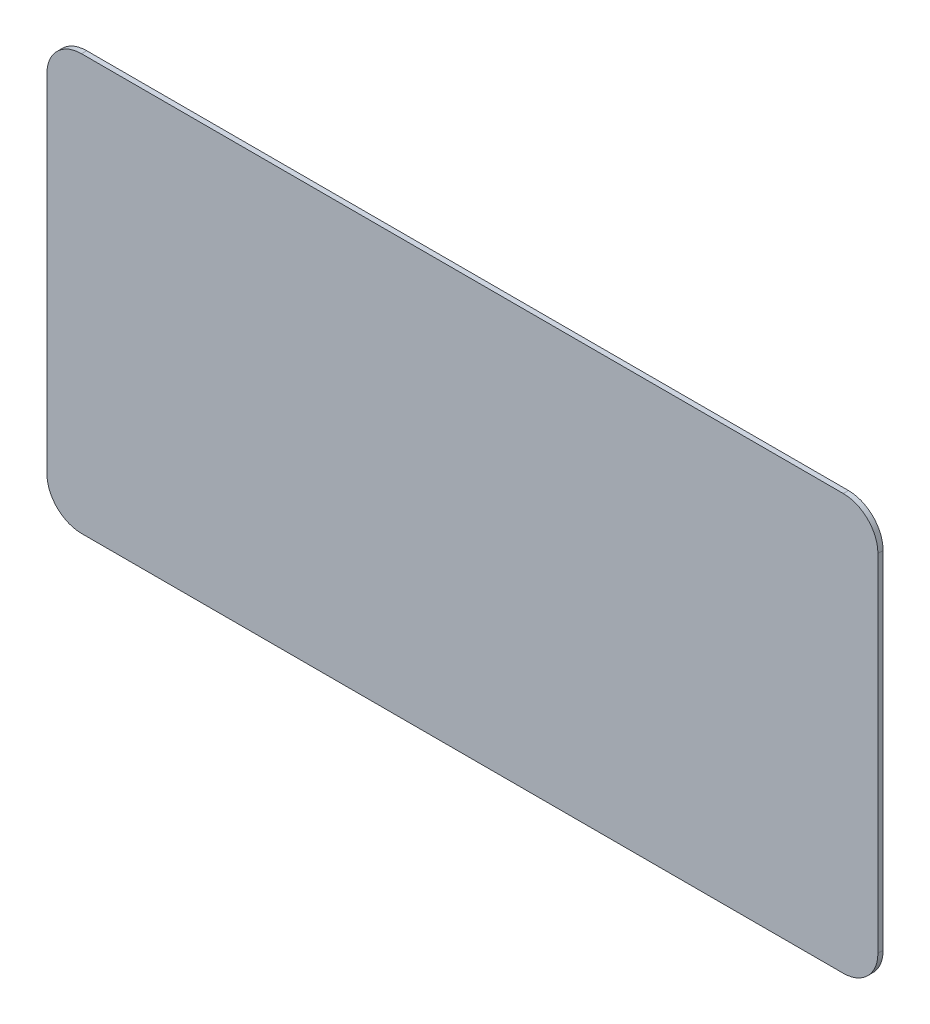
ISO-10303-21;
HEADER;
FILE_DESCRIPTION(('STEP AP214'),'2;1');
FILE_NAME('part.step','',(''),(''),'','','');
FILE_SCHEMA(('AUTOMOTIVE_DESIGN { 1 0 10303 214 1 1 1 1 }'));
ENDSEC;
DATA;
#1=APPLICATION_CONTEXT('core data for automotive mechanical design processes');
#2=APPLICATION_PROTOCOL_DEFINITION('international standard','automotive_design',2000,#1);
#3=PRODUCT_CONTEXT('',#1,'mechanical');
#4=PRODUCT('Part','Part','',(#3));
#5=PRODUCT_RELATED_PRODUCT_CATEGORY('part','',(#4));
#6=PRODUCT_DEFINITION_FORMATION('','',#4);
#7=PRODUCT_DEFINITION_CONTEXT('part definition',#1,'design');
#8=PRODUCT_DEFINITION('design','',#6,#7);
#9=PRODUCT_DEFINITION_SHAPE('','',#8);
#10=(LENGTH_UNIT() NAMED_UNIT(*) SI_UNIT(.MILLI.,.METRE.));
#11=(NAMED_UNIT(*) PLANE_ANGLE_UNIT() SI_UNIT($,.RADIAN.));
#12=(NAMED_UNIT(*) SI_UNIT($,.STERADIAN.) SOLID_ANGLE_UNIT());
#13=UNCERTAINTY_MEASURE_WITH_UNIT(LENGTH_MEASURE(1.E-05),#10,'distance_accuracy_value','');
#14=(GEOMETRIC_REPRESENTATION_CONTEXT(3) GLOBAL_UNCERTAINTY_ASSIGNED_CONTEXT((#13)) GLOBAL_UNIT_ASSIGNED_CONTEXT((#10,
#11,#12)) REPRESENTATION_CONTEXT('',''));
#15=CARTESIAN_POINT('',(0.,0.,0.));
#16=DIRECTION('',(0.,0.,1.));
#17=DIRECTION('',(1.,0.,0.));
#18=AXIS2_PLACEMENT_3D('',#15,#16,#17);
#19=CARTESIAN_POINT('',(23.,11.,0.));
#20=DIRECTION('',(0.,0.,-1.));
#21=DIRECTION('',(-1.,0.,0.));
#22=AXIS2_PLACEMENT_3D('',#19,#20,#21);
#23=PLANE('',#22);
#24=CARTESIAN_POINT('',(0.999999999999994,11.,0.));
#25=DIRECTION('',(0.,0.,-1.));
#26=DIRECTION('',(-1.,0.,0.));
#27=AXIS2_PLACEMENT_3D('',#24,#25,#26);
#28=CIRCLE('',#27,1.);
#29=CARTESIAN_POINT('',(0.999999999999997,12.,0.));
#30=VERTEX_POINT('',#29);
#31=CARTESIAN_POINT('',(0.,11.,0.));
#32=VERTEX_POINT('',#31);
#33=EDGE_CURVE('E105',#30,#32,#28,.F.);
#34=ORIENTED_EDGE('',*,*,#33,.F.);
#35=DIRECTION('',(1.,0.,0.));
#36=VECTOR('',#35,1.);
#37=CARTESIAN_POINT('',(1.,12.,0.));
#38=LINE('',#37,#36);
#39=CARTESIAN_POINT('',(23.,12.,0.));
#40=VERTEX_POINT('',#39);
#41=EDGE_CURVE('E84',#30,#40,#38,.T.);
#42=ORIENTED_EDGE('',*,*,#41,.T.);
#43=CARTESIAN_POINT('',(23.,11.,0.));
#44=DIRECTION('',(0.,0.,-1.));
#45=DIRECTION('',(-1.,0.,0.));
#46=AXIS2_PLACEMENT_3D('',#43,#44,#45);
#47=CIRCLE('',#46,1.);
#48=CARTESIAN_POINT('',(24.,11.,0.));
#49=VERTEX_POINT('',#48);
#50=EDGE_CURVE('E20',#40,#49,#47,.T.);
#51=ORIENTED_EDGE('',*,*,#50,.T.);
#52=DIRECTION('',(0.,-1.,0.));
#53=VECTOR('',#52,1.);
#54=CARTESIAN_POINT('',(24.,1.00000000000001,0.));
#55=LINE('',#54,#53);
#56=CARTESIAN_POINT('',(24.,1.,0.));
#57=VERTEX_POINT('',#56);
#58=EDGE_CURVE('E81',#49,#57,#55,.T.);
#59=ORIENTED_EDGE('',*,*,#58,.T.);
#60=CARTESIAN_POINT('',(23.,1.,0.));
#61=DIRECTION('',(0.,0.,-1.));
#62=DIRECTION('',(-1.,0.,0.));
#63=AXIS2_PLACEMENT_3D('',#60,#61,#62);
#64=CIRCLE('',#63,1.);
#65=CARTESIAN_POINT('',(23.,0.,0.));
#66=VERTEX_POINT('',#65);
#67=EDGE_CURVE('E91',#66,#57,#64,.F.);
#68=ORIENTED_EDGE('',*,*,#67,.F.);
#69=DIRECTION('',(-1.,0.,0.));
#70=VECTOR('',#69,1.);
#71=CARTESIAN_POINT('',(1.00000000000001,0.,0.));
#72=LINE('',#71,#70);
#73=CARTESIAN_POINT('',(1.,0.,0.));
#74=VERTEX_POINT('',#73);
#75=EDGE_CURVE('E116',#66,#74,#72,.T.);
#76=ORIENTED_EDGE('',*,*,#75,.T.);
#77=CARTESIAN_POINT('',(1.,1.,0.));
#78=DIRECTION('',(0.,0.,-1.));
#79=DIRECTION('',(-1.,0.,0.));
#80=AXIS2_PLACEMENT_3D('',#77,#78,#79);
#81=CIRCLE('',#80,1.);
#82=CARTESIAN_POINT('',(0.,1.,0.));
#83=VERTEX_POINT('',#82);
#84=EDGE_CURVE('E112',#83,#74,#81,.F.);
#85=ORIENTED_EDGE('',*,*,#84,.F.);
#86=DIRECTION('',(0.,1.,0.));
#87=VECTOR('',#86,1.);
#88=CARTESIAN_POINT('',(0.,1.00000000000001,0.));
#89=LINE('',#88,#87);
#90=EDGE_CURVE('E109',#83,#32,#89,.T.);
#91=ORIENTED_EDGE('',*,*,#90,.T.);
#92=EDGE_LOOP('',(#34,#42,#51,#59,#68,#76,#85,#91));
#93=FACE_BOUND('',#92,.T.);
#94=ADVANCED_FACE('F17',(#93),#23,.T.);
#95=CARTESIAN_POINT('',(24.,1.00000000000001,0.150000000000004));
#96=DIRECTION('',(-1.,0.,0.));
#97=DIRECTION('',(0.,-1.,0.));
#98=AXIS2_PLACEMENT_3D('',#95,#96,#97);
#99=PLANE('',#98);
#100=DIRECTION('',(0.,0.,-1.));
#101=VECTOR('',#100,1.);
#102=CARTESIAN_POINT('',(24.,11.,0.150000000000001));
#103=LINE('',#102,#101);
#104=CARTESIAN_POINT('',(24.,11.,0.150000000000001));
#105=VERTEX_POINT('',#104);
#106=EDGE_CURVE('E89',#105,#49,#103,.T.);
#107=ORIENTED_EDGE('',*,*,#106,.F.);
#108=DIRECTION('',(0.,1.,0.));
#109=VECTOR('',#108,1.);
#110=CARTESIAN_POINT('',(24.,11.,0.150000000000001));
#111=LINE('',#110,#109);
#112=CARTESIAN_POINT('',(24.,1.,0.150000000000004));
#113=VERTEX_POINT('',#112);
#114=EDGE_CURVE('E94',#105,#113,#111,.F.);
#115=ORIENTED_EDGE('',*,*,#114,.T.);
#116=DIRECTION('',(0.,0.,-1.));
#117=VECTOR('',#116,1.);
#118=CARTESIAN_POINT('',(24.,1.00000000000001,0.150000000000001));
#119=LINE('',#118,#117);
#120=EDGE_CURVE('E90',#57,#113,#119,.F.);
#121=ORIENTED_EDGE('',*,*,#120,.F.);
#122=ORIENTED_EDGE('',*,*,#58,.F.);
#123=EDGE_LOOP('',(#107,#115,#121,#122));
#124=FACE_BOUND('',#123,.T.);
#125=ADVANCED_FACE('F87',(#124),#99,.F.);
#126=CARTESIAN_POINT('',(23.,1.,0.150000000000001));
#127=DIRECTION('',(0.,0.,-1.));
#128=DIRECTION('',(-1.,0.,0.));
#129=AXIS2_PLACEMENT_3D('',#126,#127,#128);
#130=CYLINDRICAL_SURFACE('',#129,1.);
#131=CARTESIAN_POINT('',(23.,1.,0.150000000000004));
#132=DIRECTION('',(0.,0.,-1.));
#133=DIRECTION('',(-1.,0.,0.));
#134=AXIS2_PLACEMENT_3D('',#131,#132,#133);
#135=CIRCLE('',#134,1.);
#136=CARTESIAN_POINT('',(23.,0.,0.150000000000003));
#137=VERTEX_POINT('',#136);
#138=EDGE_CURVE('E96',#113,#137,#135,.T.);
#139=ORIENTED_EDGE('',*,*,#138,.T.);
#140=DIRECTION('',(0.,0.,1.));
#141=VECTOR('',#140,1.);
#142=CARTESIAN_POINT('',(23.,0.,0.150000000000004));
#143=LINE('',#142,#141);
#144=EDGE_CURVE('E113',#137,#66,#143,.F.);
#145=ORIENTED_EDGE('',*,*,#144,.T.);
#146=ORIENTED_EDGE('',*,*,#67,.T.);
#147=ORIENTED_EDGE('',*,*,#120,.T.);
#148=EDGE_LOOP('',(#139,#145,#146,#147));
#149=FACE_BOUND('',#148,.T.);
#150=ADVANCED_FACE('F135',(#149),#130,.T.);
#151=CARTESIAN_POINT('',(1.00000000000001,0.,0.150000000000004));
#152=DIRECTION('',(0.,1.,0.));
#153=DIRECTION('',(-1.,0.,0.));
#154=AXIS2_PLACEMENT_3D('',#151,#152,#153);
#155=PLANE('',#154);
#156=ORIENTED_EDGE('',*,*,#144,.F.);
#157=DIRECTION('',(-1.,0.,0.));
#158=VECTOR('',#157,1.);
#159=CARTESIAN_POINT('',(23.,0.,0.150000000000001));
#160=LINE('',#159,#158);
#161=CARTESIAN_POINT('',(1.,0.,0.150000000000003));
#162=VERTEX_POINT('',#161);
#163=EDGE_CURVE('E130',#137,#162,#160,.T.);
#164=ORIENTED_EDGE('',*,*,#163,.T.);
#165=DIRECTION('',(0.,0.,-1.));
#166=VECTOR('',#165,1.);
#167=CARTESIAN_POINT('',(1.00000000000001,0.,0.150000000000004));
#168=LINE('',#167,#166);
#169=EDGE_CURVE('E110',#74,#162,#168,.F.);
#170=ORIENTED_EDGE('',*,*,#169,.F.);
#171=ORIENTED_EDGE('',*,*,#75,.F.);
#172=EDGE_LOOP('',(#156,#164,#170,#171));
#173=FACE_BOUND('',#172,.T.);
#174=ADVANCED_FACE('F140',(#173),#155,.F.);
#175=CARTESIAN_POINT('',(1.,1.,0.150000000000004));
#176=DIRECTION('',(0.,0.,-1.));
#177=DIRECTION('',(-1.,0.,0.));
#178=AXIS2_PLACEMENT_3D('',#175,#176,#177);
#179=CYLINDRICAL_SURFACE('',#178,1.);
#180=CARTESIAN_POINT('',(1.,1.,0.150000000000004));
#181=DIRECTION('',(0.,0.,-1.));
#182=DIRECTION('',(-1.,0.,0.));
#183=AXIS2_PLACEMENT_3D('',#180,#181,#182);
#184=CIRCLE('',#183,1.);
#185=CARTESIAN_POINT('',(0.,1.,0.150000000000003));
#186=VERTEX_POINT('',#185);
#187=EDGE_CURVE('E127',#162,#186,#184,.T.);
#188=ORIENTED_EDGE('',*,*,#187,.T.);
#189=DIRECTION('',(0.,0.,1.));
#190=VECTOR('',#189,1.);
#191=CARTESIAN_POINT('',(0.,1.00000000000001,0.150000000000004));
#192=LINE('',#191,#190);
#193=EDGE_CURVE('E106',#186,#83,#192,.F.);
#194=ORIENTED_EDGE('',*,*,#193,.T.);
#195=ORIENTED_EDGE('',*,*,#84,.T.);
#196=ORIENTED_EDGE('',*,*,#169,.T.);
#197=EDGE_LOOP('',(#188,#194,#195,#196));
#198=FACE_BOUND('',#197,.T.);
#199=ADVANCED_FACE('F145',(#198),#179,.T.);
#200=CARTESIAN_POINT('',(0.,1.00000000000001,0.150000000000004));
#201=DIRECTION('',(1.,0.,0.));
#202=DIRECTION('',(0.,1.,0.));
#203=AXIS2_PLACEMENT_3D('',#200,#201,#202);
#204=PLANE('',#203);
#205=ORIENTED_EDGE('',*,*,#193,.F.);
#206=DIRECTION('',(0.,1.,0.));
#207=VECTOR('',#206,1.);
#208=CARTESIAN_POINT('',(0.,11.,0.150000000000001));
#209=LINE('',#208,#207);
#210=CARTESIAN_POINT('',(0.,11.,0.150000000000001));
#211=VERTEX_POINT('',#210);
#212=EDGE_CURVE('E126',#186,#211,#209,.T.);
#213=ORIENTED_EDGE('',*,*,#212,.T.);
#214=DIRECTION('',(0.,0.,-1.));
#215=VECTOR('',#214,1.);
#216=CARTESIAN_POINT('',(0.,11.,0.150000000000001));
#217=LINE('',#216,#215);
#218=EDGE_CURVE('E103',#32,#211,#217,.F.);
#219=ORIENTED_EDGE('',*,*,#218,.F.);
#220=ORIENTED_EDGE('',*,*,#90,.F.);
#221=EDGE_LOOP('',(#205,#213,#219,#220));
#222=FACE_BOUND('',#221,.T.);
#223=ADVANCED_FACE('F163',(#222),#204,.F.);
#224=CARTESIAN_POINT('',(0.999999999999994,11.,0.150000000000001));
#225=DIRECTION('',(0.,0.,-1.));
#226=DIRECTION('',(-1.,0.,0.));
#227=AXIS2_PLACEMENT_3D('',#224,#225,#226);
#228=CYLINDRICAL_SURFACE('',#227,1.);
#229=CARTESIAN_POINT('',(0.999999999999994,11.,0.150000000000001));
#230=DIRECTION('',(0.,0.,-1.));
#231=DIRECTION('',(-1.,0.,0.));
#232=AXIS2_PLACEMENT_3D('',#229,#230,#231);
#233=CIRCLE('',#232,1.);
#234=CARTESIAN_POINT('',(0.999999999999997,12.,0.150000000000001));
#235=VERTEX_POINT('',#234);
#236=EDGE_CURVE('E123',#211,#235,#233,.T.);
#237=ORIENTED_EDGE('',*,*,#236,.T.);
#238=DIRECTION('',(0.,0.,1.));
#239=VECTOR('',#238,1.);
#240=CARTESIAN_POINT('',(1.,12.,0.150000000000001));
#241=LINE('',#240,#239);
#242=EDGE_CURVE('E100',#235,#30,#241,.F.);
#243=ORIENTED_EDGE('',*,*,#242,.T.);
#244=ORIENTED_EDGE('',*,*,#33,.T.);
#245=ORIENTED_EDGE('',*,*,#218,.T.);
#246=EDGE_LOOP('',(#237,#243,#244,#245));
#247=FACE_BOUND('',#246,.T.);
#248=ADVANCED_FACE('F161',(#247),#228,.T.);
#249=CARTESIAN_POINT('',(1.,12.,0.150000000000001));
#250=DIRECTION('',(0.,-1.,0.));
#251=DIRECTION('',(1.,0.,0.));
#252=AXIS2_PLACEMENT_3D('',#249,#250,#251);
#253=PLANE('',#252);
#254=ORIENTED_EDGE('',*,*,#242,.F.);
#255=DIRECTION('',(-1.,0.,0.));
#256=VECTOR('',#255,1.);
#257=CARTESIAN_POINT('',(23.,12.,0.150000000000001));
#258=LINE('',#257,#256);
#259=CARTESIAN_POINT('',(23.,12.,0.150000000000001));
#260=VERTEX_POINT('',#259);
#261=EDGE_CURVE('E26',#235,#260,#258,.F.);
#262=ORIENTED_EDGE('',*,*,#261,.T.);
#263=DIRECTION('',(0.,0.,-1.));
#264=VECTOR('',#263,1.);
#265=CARTESIAN_POINT('',(23.,12.,0.150000000000001));
#266=LINE('',#265,#264);
#267=EDGE_CURVE('E34',#40,#260,#266,.F.);
#268=ORIENTED_EDGE('',*,*,#267,.F.);
#269=ORIENTED_EDGE('',*,*,#41,.F.);
#270=EDGE_LOOP('',(#254,#262,#268,#269));
#271=FACE_BOUND('',#270,.T.);
#272=ADVANCED_FACE('F159',(#271),#253,.F.);
#273=CARTESIAN_POINT('',(23.,11.,0.150000000000001));
#274=DIRECTION('',(0.,0.,-1.));
#275=DIRECTION('',(-1.,0.,0.));
#276=AXIS2_PLACEMENT_3D('',#273,#274,#275);
#277=CYLINDRICAL_SURFACE('',#276,1.);
#278=CARTESIAN_POINT('',(23.,11.,0.150000000000001));
#279=DIRECTION('',(0.,0.,-1.));
#280=DIRECTION('',(-1.,0.,0.));
#281=AXIS2_PLACEMENT_3D('',#278,#279,#280);
#282=CIRCLE('',#281,1.);
#283=EDGE_CURVE('E11',#260,#105,#282,.T.);
#284=ORIENTED_EDGE('',*,*,#283,.T.);
#285=ORIENTED_EDGE('',*,*,#106,.T.);
#286=ORIENTED_EDGE('',*,*,#50,.F.);
#287=ORIENTED_EDGE('',*,*,#267,.T.);
#288=EDGE_LOOP('',(#284,#285,#286,#287));
#289=FACE_BOUND('',#288,.T.);
#290=ADVANCED_FACE('F93',(#289),#277,.T.);
#291=CARTESIAN_POINT('',(23.,11.,0.150000000000001));
#292=DIRECTION('',(0.,0.,-1.));
#293=DIRECTION('',(-1.,0.,0.));
#294=AXIS2_PLACEMENT_3D('',#291,#292,#293);
#295=PLANE('',#294);
#296=ORIENTED_EDGE('',*,*,#261,.F.);
#297=ORIENTED_EDGE('',*,*,#236,.F.);
#298=ORIENTED_EDGE('',*,*,#212,.F.);
#299=ORIENTED_EDGE('',*,*,#187,.F.);
#300=ORIENTED_EDGE('',*,*,#163,.F.);
#301=ORIENTED_EDGE('',*,*,#138,.F.);
#302=ORIENTED_EDGE('',*,*,#114,.F.);
#303=ORIENTED_EDGE('',*,*,#283,.F.);
#304=EDGE_LOOP('',(#296,#297,#298,#299,#300,#301,#302,#303));
#305=FACE_BOUND('',#304,.T.);
#306=ADVANCED_FACE('F149',(#305),#295,.F.);
#307=CLOSED_SHELL('',(#94,#125,#150,#174,#199,#223,#248,#272,#290,#306));
#308=MANIFOLD_SOLID_BREP('B1',#307);
#309=ADVANCED_BREP_SHAPE_REPRESENTATION('',(#18,#308),#14);
#310=SHAPE_DEFINITION_REPRESENTATION(#9,#309);
ENDSEC;
END-ISO-10303-21;
